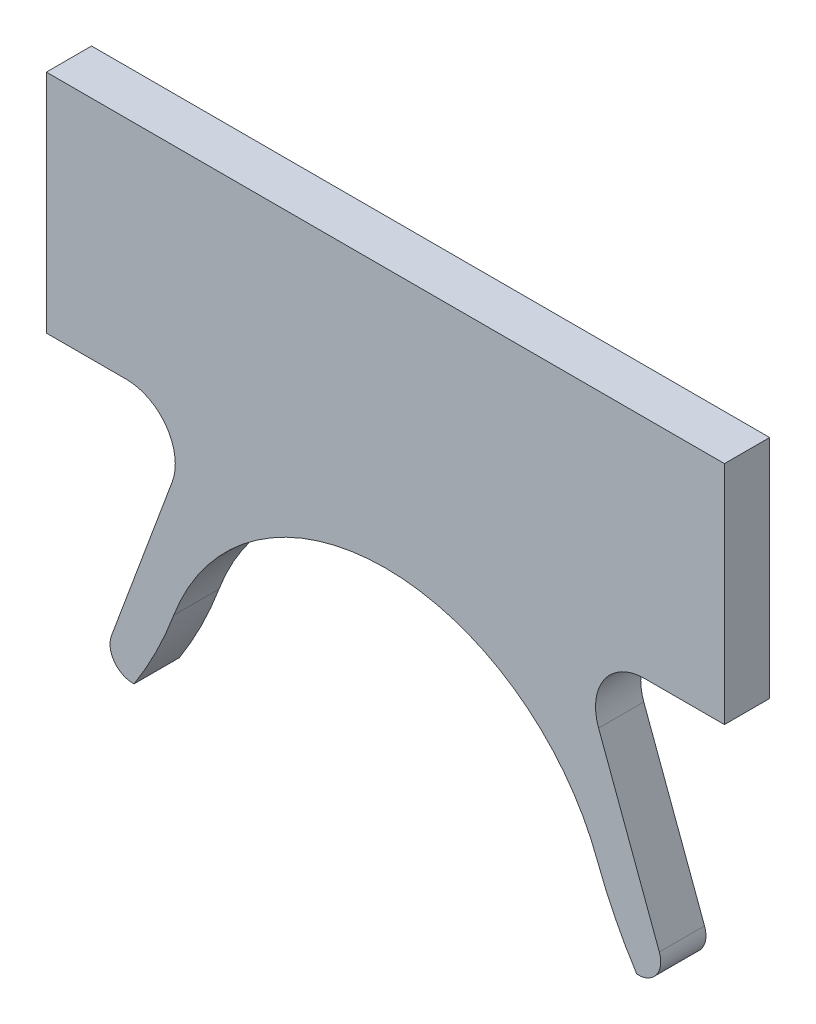
ISO-10303-21;
HEADER;
FILE_DESCRIPTION(('STEP AP214'),'2;1');
FILE_NAME('part.step','',(''),(''),'','','');
FILE_SCHEMA(('AUTOMOTIVE_DESIGN { 1 0 10303 214 1 1 1 1 }'));
ENDSEC;
DATA;
#1=APPLICATION_CONTEXT('core data for automotive mechanical design processes');
#2=APPLICATION_PROTOCOL_DEFINITION('international standard','automotive_design',2000,#1);
#3=PRODUCT_CONTEXT('',#1,'mechanical');
#4=PRODUCT('Part','Part','',(#3));
#5=PRODUCT_RELATED_PRODUCT_CATEGORY('part','',(#4));
#6=PRODUCT_DEFINITION_FORMATION('','',#4);
#7=PRODUCT_DEFINITION_CONTEXT('part definition',#1,'design');
#8=PRODUCT_DEFINITION('design','',#6,#7);
#9=PRODUCT_DEFINITION_SHAPE('','',#8);
#10=(LENGTH_UNIT() NAMED_UNIT(*) SI_UNIT(.MILLI.,.METRE.));
#11=(NAMED_UNIT(*) PLANE_ANGLE_UNIT() SI_UNIT($,.RADIAN.));
#12=(NAMED_UNIT(*) SI_UNIT($,.STERADIAN.) SOLID_ANGLE_UNIT());
#13=UNCERTAINTY_MEASURE_WITH_UNIT(LENGTH_MEASURE(1.E-05),#10,'distance_accuracy_value','');
#14=(GEOMETRIC_REPRESENTATION_CONTEXT(3) GLOBAL_UNCERTAINTY_ASSIGNED_CONTEXT((#13)) GLOBAL_UNIT_ASSIGNED_CONTEXT((#10,
#11,#12)) REPRESENTATION_CONTEXT('',''));
#15=CARTESIAN_POINT('',(0.,0.,0.));
#16=DIRECTION('',(0.,0.,1.));
#17=DIRECTION('',(1.,0.,0.));
#18=AXIS2_PLACEMENT_3D('',#15,#16,#17);
#19=CARTESIAN_POINT('',(-22.9188787127757,18.6730474571845,4.));
#20=DIRECTION('',(0.,0.,-1.));
#21=DIRECTION('',(-1.,0.,0.));
#22=AXIS2_PLACEMENT_3D('',#19,#20,#21);
#23=CYLINDRICAL_SURFACE('',#22,4.32695254281545);
#24=CARTESIAN_POINT('',(-22.9188787127757,18.6730474571845,0.));
#25=DIRECTION('',(0.,0.,-1.));
#26=DIRECTION('',(1.,0.,0.));
#27=AXIS2_PLACEMENT_3D('',#24,#25,#26);
#28=CIRCLE('',#27,4.32695254281545);
#29=CARTESIAN_POINT('',(-22.9188787127757,23.,0.));
#30=VERTEX_POINT('',#29);
#31=CARTESIAN_POINT('',(-18.8627272520322,17.1663445550549,0.));
#32=VERTEX_POINT('',#31);
#33=EDGE_CURVE('E179',#30,#32,#28,.T.);
#34=ORIENTED_EDGE('',*,*,#33,.T.);
#35=DIRECTION('',(0.,0.,-1.));
#36=VECTOR('',#35,1.);
#37=CARTESIAN_POINT('',(-18.8627272520322,17.1663445550549,4.));
#38=LINE('',#37,#36);
#39=CARTESIAN_POINT('',(-18.8627272520322,17.1663445550549,4.));
#40=VERTEX_POINT('',#39);
#41=EDGE_CURVE('E11',#40,#32,#38,.T.);
#42=ORIENTED_EDGE('',*,*,#41,.F.);
#43=CARTESIAN_POINT('',(-22.9188787127757,18.6730474571845,4.));
#44=DIRECTION('',(0.,0.,-1.));
#45=DIRECTION('',(1.,0.,0.));
#46=AXIS2_PLACEMENT_3D('',#43,#44,#45);
#47=CIRCLE('',#46,4.32695254281545);
#48=CARTESIAN_POINT('',(-22.9188787127757,23.,4.));
#49=VERTEX_POINT('',#48);
#50=EDGE_CURVE('E209',#49,#40,#47,.T.);
#51=ORIENTED_EDGE('',*,*,#50,.F.);
#52=DIRECTION('',(0.,0.,-1.));
#53=VECTOR('',#52,1.);
#54=CARTESIAN_POINT('',(-22.9188787127757,23.,4.));
#55=LINE('',#54,#53);
#56=EDGE_CURVE('E175',#49,#30,#55,.T.);
#57=ORIENTED_EDGE('',*,*,#56,.T.);
#58=EDGE_LOOP('',(#34,#42,#51,#57));
#59=FACE_BOUND('',#58,.T.);
#60=ADVANCED_FACE('F35',(#59),#23,.F.);
#61=CARTESIAN_POINT('',(-24.2377403042803,2.69642682105744,4.));
#62=DIRECTION('',(0.937415287227579,-0.348213410528709,0.));
#63=DIRECTION('',(0.348213410528709,0.937415287227579,0.));
#64=AXIS2_PLACEMENT_3D('',#61,#62,#63);
#65=PLANE('',#64);
#66=DIRECTION('',(-0.348213410528709,-0.937415287227579,0.));
#67=VECTOR('',#66,1.);
#68=CARTESIAN_POINT('',(-24.2377403042803,2.69642682105744,0.));
#69=LINE('',#68,#67);
#70=CARTESIAN_POINT('',(-24.2377403042803,2.69642682105744,0.));
#71=VERTEX_POINT('',#70);
#72=EDGE_CURVE('E182',#32,#71,#69,.T.);
#73=ORIENTED_EDGE('',*,*,#72,.T.);
#74=DIRECTION('',(0.,0.,-1.));
#75=VECTOR('',#74,1.);
#76=CARTESIAN_POINT('',(-24.2377403042803,2.69642682105744,4.));
#77=LINE('',#76,#75);
#78=CARTESIAN_POINT('',(-24.2377403042803,2.69642682105744,4.));
#79=VERTEX_POINT('',#78);
#80=EDGE_CURVE('E43',#79,#71,#77,.T.);
#81=ORIENTED_EDGE('',*,*,#80,.F.);
#82=DIRECTION('',(-0.348213410528709,-0.937415287227579,0.));
#83=VECTOR('',#82,1.);
#84=CARTESIAN_POINT('',(-24.2377403042803,2.69642682105744,4.));
#85=LINE('',#84,#83);
#86=EDGE_CURVE('E118',#40,#79,#85,.T.);
#87=ORIENTED_EDGE('',*,*,#86,.F.);
#88=ORIENTED_EDGE('',*,*,#41,.T.);
#89=EDGE_LOOP('',(#73,#81,#87,#88));
#90=FACE_BOUND('',#89,.T.);
#91=ADVANCED_FACE('F307',(#90),#65,.F.);
#92=CARTESIAN_POINT('',(-22.3629097298251,2.,4.));
#93=DIRECTION('',(0.,0.,-1.));
#94=DIRECTION('',(-1.,0.,0.));
#95=AXIS2_PLACEMENT_3D('',#92,#93,#94);
#96=CYLINDRICAL_SURFACE('',#95,2.);
#97=CARTESIAN_POINT('',(-22.3629097298251,2.,0.));
#98=DIRECTION('',(0.,0.,1.));
#99=DIRECTION('',(1.,0.,0.));
#100=AXIS2_PLACEMENT_3D('',#97,#98,#99);
#101=CIRCLE('',#100,2.);
#102=CARTESIAN_POINT('',(-22.3629097298251,0.,0.));
#103=VERTEX_POINT('',#102);
#104=EDGE_CURVE('E184',#71,#103,#101,.T.);
#105=ORIENTED_EDGE('',*,*,#104,.T.);
#106=DIRECTION('',(0.,0.,-1.));
#107=VECTOR('',#106,1.);
#108=CARTESIAN_POINT('',(-22.3629097298251,0.,4.));
#109=LINE('',#108,#107);
#110=CARTESIAN_POINT('',(-22.3629097298251,0.,4.));
#111=VERTEX_POINT('',#110);
#112=EDGE_CURVE('E240',#111,#103,#109,.T.);
#113=ORIENTED_EDGE('',*,*,#112,.F.);
#114=CARTESIAN_POINT('',(-22.3629097298251,2.,4.));
#115=DIRECTION('',(0.,0.,1.));
#116=DIRECTION('',(1.,0.,0.));
#117=AXIS2_PLACEMENT_3D('',#114,#115,#116);
#118=CIRCLE('',#117,2.);
#119=EDGE_CURVE('E248',#79,#111,#118,.T.);
#120=ORIENTED_EDGE('',*,*,#119,.F.);
#121=ORIENTED_EDGE('',*,*,#80,.T.);
#122=EDGE_LOOP('',(#105,#113,#120,#121));
#123=FACE_BOUND('',#122,.T.);
#124=ADVANCED_FACE('F246',(#123),#96,.T.);
#125=CARTESIAN_POINT('',(-22.2393582556777,0.,4.));
#126=DIRECTION('',(0.,1.,0.));
#127=DIRECTION('',(-1.,0.,0.));
#128=AXIS2_PLACEMENT_3D('',#125,#126,#127);
#129=PLANE('',#128);
#130=DIRECTION('',(1.,0.,0.));
#131=VECTOR('',#130,1.);
#132=CARTESIAN_POINT('',(-22.2393582556777,0.,0.));
#133=LINE('',#132,#131);
#134=CARTESIAN_POINT('',(-22.2393582556777,0.,0.));
#135=VERTEX_POINT('',#134);
#136=EDGE_CURVE('E186',#103,#135,#133,.T.);
#137=ORIENTED_EDGE('',*,*,#136,.T.);
#138=DIRECTION('',(0.,0.,-1.));
#139=VECTOR('',#138,1.);
#140=CARTESIAN_POINT('',(-22.2393582556777,0.,4.));
#141=LINE('',#140,#139);
#142=CARTESIAN_POINT('',(-22.2393582556777,0.,4.));
#143=VERTEX_POINT('',#142);
#144=EDGE_CURVE('E237',#143,#135,#141,.T.);
#145=ORIENTED_EDGE('',*,*,#144,.F.);
#146=DIRECTION('',(1.,0.,0.));
#147=VECTOR('',#146,1.);
#148=CARTESIAN_POINT('',(-22.2393582556777,0.,4.));
#149=LINE('',#148,#147);
#150=EDGE_CURVE('E266',#111,#143,#149,.T.);
#151=ORIENTED_EDGE('',*,*,#150,.F.);
#152=ORIENTED_EDGE('',*,*,#112,.T.);
#153=EDGE_LOOP('',(#137,#145,#151,#152));
#154=FACE_BOUND('',#153,.T.);
#155=ADVANCED_FACE('F257',(#154),#129,.F.);
#156=CARTESIAN_POINT('',(-53.4627327981077,20.0083136880861,4.));
#157=DIRECTION('',(0.,0.,-1.));
#158=DIRECTION('',(-1.,0.,0.));
#159=AXIS2_PLACEMENT_3D('',#156,#157,#158);
#160=CYLINDRICAL_SURFACE('',#159,37.0841170106249);
#161=CARTESIAN_POINT('',(-53.4627327981077,20.0083136880861,0.));
#162=DIRECTION('',(0.,0.,1.));
#163=DIRECTION('',(1.,0.,0.));
#164=AXIS2_PLACEMENT_3D('',#161,#162,#163);
#165=CIRCLE('',#164,37.0841170106249);
#166=CARTESIAN_POINT('',(-18.7312112713093,7.01011585564579,0.));
#167=VERTEX_POINT('',#166);
#168=EDGE_CURVE('E188',#135,#167,#165,.T.);
#169=ORIENTED_EDGE('',*,*,#168,.T.);
#170=DIRECTION('',(0.,0.,-1.));
#171=VECTOR('',#170,1.);
#172=CARTESIAN_POINT('',(-18.7312112713093,7.01011585564579,4.));
#173=LINE('',#172,#171);
#174=CARTESIAN_POINT('',(-18.7312112713093,7.01011585564579,4.));
#175=VERTEX_POINT('',#174);
#176=EDGE_CURVE('E234',#175,#167,#173,.T.);
#177=ORIENTED_EDGE('',*,*,#176,.F.);
#178=CARTESIAN_POINT('',(-53.4627327981077,20.0083136880861,4.));
#179=DIRECTION('',(0.,0.,1.));
#180=DIRECTION('',(1.,0.,0.));
#181=AXIS2_PLACEMENT_3D('',#178,#179,#180);
#182=CIRCLE('',#181,37.0841170106249);
#183=EDGE_CURVE('E263',#143,#175,#182,.T.);
#184=ORIENTED_EDGE('',*,*,#183,.F.);
#185=ORIENTED_EDGE('',*,*,#144,.T.);
#186=EDGE_LOOP('',(#169,#177,#184,#185));
#187=FACE_BOUND('',#186,.T.);
#188=ADVANCED_FACE('F261',(#187),#160,.T.);
#189=CARTESIAN_POINT('',(0.,0.,4.));
#190=DIRECTION('',(0.,0.,-1.));
#191=DIRECTION('',(-1.,0.,0.));
#192=AXIS2_PLACEMENT_3D('',#189,#190,#191);
#193=CYLINDRICAL_SURFACE('',#192,20.);
#194=CARTESIAN_POINT('',(0.,0.,0.));
#195=DIRECTION('',(0.,0.,-1.));
#196=DIRECTION('',(1.,0.,0.));
#197=AXIS2_PLACEMENT_3D('',#194,#195,#196);
#198=CIRCLE('',#197,20.);
#199=CARTESIAN_POINT('',(18.7312112713093,7.01011585564579,0.));
#200=VERTEX_POINT('',#199);
#201=EDGE_CURVE('E190',#167,#200,#198,.T.);
#202=ORIENTED_EDGE('',*,*,#201,.T.);
#203=DIRECTION('',(0.,0.,-1.));
#204=VECTOR('',#203,1.);
#205=CARTESIAN_POINT('',(18.7312112713093,7.01011585564579,4.));
#206=LINE('',#205,#204);
#207=CARTESIAN_POINT('',(18.7312112713093,7.01011585564579,4.));
#208=VERTEX_POINT('',#207);
#209=EDGE_CURVE('E231',#208,#200,#206,.T.);
#210=ORIENTED_EDGE('',*,*,#209,.F.);
#211=CARTESIAN_POINT('',(0.,0.,4.));
#212=DIRECTION('',(0.,0.,-1.));
#213=DIRECTION('',(1.,0.,0.));
#214=AXIS2_PLACEMENT_3D('',#211,#212,#213);
#215=CIRCLE('',#214,20.);
#216=EDGE_CURVE('E265',#175,#208,#215,.T.);
#217=ORIENTED_EDGE('',*,*,#216,.F.);
#218=ORIENTED_EDGE('',*,*,#176,.T.);
#219=EDGE_LOOP('',(#202,#210,#217,#218));
#220=FACE_BOUND('',#219,.T.);
#221=ADVANCED_FACE('F320',(#220),#193,.F.);
#222=CARTESIAN_POINT('',(53.4627327981077,20.0083136880861,4.));
#223=DIRECTION('',(0.,0.,-1.));
#224=DIRECTION('',(-1.,0.,0.));
#225=AXIS2_PLACEMENT_3D('',#222,#223,#224);
#226=CYLINDRICAL_SURFACE('',#225,37.0841170106249);
#227=CARTESIAN_POINT('',(53.4627327981077,20.0083136880861,0.));
#228=DIRECTION('',(0.,0.,1.));
#229=DIRECTION('',(-1.,0.,0.));
#230=AXIS2_PLACEMENT_3D('',#227,#228,#229);
#231=CIRCLE('',#230,37.0841170106249);
#232=CARTESIAN_POINT('',(22.2393582556777,0.,0.));
#233=VERTEX_POINT('',#232);
#234=EDGE_CURVE('E192',#200,#233,#231,.T.);
#235=ORIENTED_EDGE('',*,*,#234,.T.);
#236=DIRECTION('',(0.,0.,-1.));
#237=VECTOR('',#236,1.);
#238=CARTESIAN_POINT('',(22.2393582556777,0.,4.));
#239=LINE('',#238,#237);
#240=CARTESIAN_POINT('',(22.2393582556777,0.,4.));
#241=VERTEX_POINT('',#240);
#242=EDGE_CURVE('E228',#241,#233,#239,.T.);
#243=ORIENTED_EDGE('',*,*,#242,.F.);
#244=CARTESIAN_POINT('',(53.4627327981077,20.0083136880861,4.));
#245=DIRECTION('',(0.,0.,1.));
#246=DIRECTION('',(-1.,0.,0.));
#247=AXIS2_PLACEMENT_3D('',#244,#245,#246);
#248=CIRCLE('',#247,37.0841170106249);
#249=EDGE_CURVE('E268',#208,#241,#248,.T.);
#250=ORIENTED_EDGE('',*,*,#249,.F.);
#251=ORIENTED_EDGE('',*,*,#209,.T.);
#252=EDGE_LOOP('',(#235,#243,#250,#251));
#253=FACE_BOUND('',#252,.T.);
#254=ADVANCED_FACE('F323',(#253),#226,.T.);
#255=CARTESIAN_POINT('',(22.2393582556777,0.,4.));
#256=DIRECTION('',(0.,1.,0.));
#257=DIRECTION('',(-1.,0.,0.));
#258=AXIS2_PLACEMENT_3D('',#255,#256,#257);
#259=PLANE('',#258);
#260=DIRECTION('',(1.,0.,0.));
#261=VECTOR('',#260,1.);
#262=CARTESIAN_POINT('',(22.2393582556777,0.,0.));
#263=LINE('',#262,#261);
#264=CARTESIAN_POINT('',(22.3629097298251,0.,0.));
#265=VERTEX_POINT('',#264);
#266=EDGE_CURVE('E194',#233,#265,#263,.T.);
#267=ORIENTED_EDGE('',*,*,#266,.T.);
#268=DIRECTION('',(0.,0.,-1.));
#269=VECTOR('',#268,1.);
#270=CARTESIAN_POINT('',(22.3629097298251,0.,4.));
#271=LINE('',#270,#269);
#272=CARTESIAN_POINT('',(22.3629097298251,0.,4.));
#273=VERTEX_POINT('',#272);
#274=EDGE_CURVE('E225',#273,#265,#271,.T.);
#275=ORIENTED_EDGE('',*,*,#274,.F.);
#276=DIRECTION('',(1.,0.,0.));
#277=VECTOR('',#276,1.);
#278=CARTESIAN_POINT('',(22.2393582556777,0.,4.));
#279=LINE('',#278,#277);
#280=EDGE_CURVE('E274',#241,#273,#279,.T.);
#281=ORIENTED_EDGE('',*,*,#280,.F.);
#282=ORIENTED_EDGE('',*,*,#242,.T.);
#283=EDGE_LOOP('',(#267,#275,#281,#282));
#284=FACE_BOUND('',#283,.T.);
#285=ADVANCED_FACE('F327',(#284),#259,.F.);
#286=CARTESIAN_POINT('',(22.3629097298251,2.,4.));
#287=DIRECTION('',(0.,0.,-1.));
#288=DIRECTION('',(-1.,0.,0.));
#289=AXIS2_PLACEMENT_3D('',#286,#287,#288);
#290=CYLINDRICAL_SURFACE('',#289,2.);
#291=CARTESIAN_POINT('',(22.3629097298251,2.,0.));
#292=DIRECTION('',(0.,0.,1.));
#293=DIRECTION('',(-1.,0.,0.));
#294=AXIS2_PLACEMENT_3D('',#291,#292,#293);
#295=CIRCLE('',#294,2.);
#296=CARTESIAN_POINT('',(24.2377403042803,2.69642682105744,0.));
#297=VERTEX_POINT('',#296);
#298=EDGE_CURVE('E196',#265,#297,#295,.T.);
#299=ORIENTED_EDGE('',*,*,#298,.T.);
#300=DIRECTION('',(0.,0.,-1.));
#301=VECTOR('',#300,1.);
#302=CARTESIAN_POINT('',(24.2377403042803,2.69642682105744,4.));
#303=LINE('',#302,#301);
#304=CARTESIAN_POINT('',(24.2377403042803,2.69642682105744,4.));
#305=VERTEX_POINT('',#304);
#306=EDGE_CURVE('E222',#305,#297,#303,.T.);
#307=ORIENTED_EDGE('',*,*,#306,.F.);
#308=CARTESIAN_POINT('',(22.3629097298251,2.,4.));
#309=DIRECTION('',(0.,0.,1.));
#310=DIRECTION('',(-1.,0.,0.));
#311=AXIS2_PLACEMENT_3D('',#308,#309,#310);
#312=CIRCLE('',#311,2.);
#313=EDGE_CURVE('E276',#273,#305,#312,.T.);
#314=ORIENTED_EDGE('',*,*,#313,.F.);
#315=ORIENTED_EDGE('',*,*,#274,.T.);
#316=EDGE_LOOP('',(#299,#307,#314,#315));
#317=FACE_BOUND('',#316,.T.);
#318=ADVANCED_FACE('F331',(#317),#290,.T.);
#319=CARTESIAN_POINT('',(24.2377403042803,2.69642682105744,4.));
#320=DIRECTION('',(-0.937415287227579,-0.348213410528709,0.));
#321=DIRECTION('',(0.348213410528709,-0.937415287227579,0.));
#322=AXIS2_PLACEMENT_3D('',#319,#320,#321);
#323=PLANE('',#322);
#324=DIRECTION('',(-0.348213410528709,0.937415287227579,0.));
#325=VECTOR('',#324,1.);
#326=CARTESIAN_POINT('',(24.2377403042803,2.69642682105744,0.));
#327=LINE('',#326,#325);
#328=CARTESIAN_POINT('',(18.8627272520322,17.1663445550549,0.));
#329=VERTEX_POINT('',#328);
#330=EDGE_CURVE('E198',#297,#329,#327,.T.);
#331=ORIENTED_EDGE('',*,*,#330,.T.);
#332=DIRECTION('',(0.,0.,-1.));
#333=VECTOR('',#332,1.);
#334=CARTESIAN_POINT('',(18.8627272520322,17.1663445550549,4.));
#335=LINE('',#334,#333);
#336=CARTESIAN_POINT('',(18.8627272520322,17.1663445550549,4.));
#337=VERTEX_POINT('',#336);
#338=EDGE_CURVE('E219',#337,#329,#335,.T.);
#339=ORIENTED_EDGE('',*,*,#338,.F.);
#340=DIRECTION('',(-0.348213410528709,0.937415287227579,0.));
#341=VECTOR('',#340,1.);
#342=CARTESIAN_POINT('',(24.2377403042803,2.69642682105744,4.));
#343=LINE('',#342,#341);
#344=EDGE_CURVE('E278',#305,#337,#343,.T.);
#345=ORIENTED_EDGE('',*,*,#344,.F.);
#346=ORIENTED_EDGE('',*,*,#306,.T.);
#347=EDGE_LOOP('',(#331,#339,#345,#346));
#348=FACE_BOUND('',#347,.T.);
#349=ADVANCED_FACE('F335',(#348),#323,.F.);
#350=CARTESIAN_POINT('',(22.9188787127757,18.6730474571845,4.));
#351=DIRECTION('',(0.,0.,-1.));
#352=DIRECTION('',(-1.,0.,0.));
#353=AXIS2_PLACEMENT_3D('',#350,#351,#352);
#354=CYLINDRICAL_SURFACE('',#353,4.32695254281545);
#355=CARTESIAN_POINT('',(22.9188787127757,18.6730474571845,0.));
#356=DIRECTION('',(0.,0.,-1.));
#357=DIRECTION('',(-1.,0.,0.));
#358=AXIS2_PLACEMENT_3D('',#355,#356,#357);
#359=CIRCLE('',#358,4.32695254281545);
#360=CARTESIAN_POINT('',(22.9188787127757,23.,0.));
#361=VERTEX_POINT('',#360);
#362=EDGE_CURVE('E200',#329,#361,#359,.T.);
#363=ORIENTED_EDGE('',*,*,#362,.T.);
#364=DIRECTION('',(0.,0.,-1.));
#365=VECTOR('',#364,1.);
#366=CARTESIAN_POINT('',(22.9188787127757,23.,4.));
#367=LINE('',#366,#365);
#368=CARTESIAN_POINT('',(22.9188787127757,23.,4.));
#369=VERTEX_POINT('',#368);
#370=EDGE_CURVE('E216',#369,#361,#367,.T.);
#371=ORIENTED_EDGE('',*,*,#370,.F.);
#372=CARTESIAN_POINT('',(22.9188787127757,18.6730474571845,4.));
#373=DIRECTION('',(0.,0.,-1.));
#374=DIRECTION('',(-1.,0.,0.));
#375=AXIS2_PLACEMENT_3D('',#372,#373,#374);
#376=CIRCLE('',#375,4.32695254281545);
#377=EDGE_CURVE('E280',#337,#369,#376,.T.);
#378=ORIENTED_EDGE('',*,*,#377,.F.);
#379=ORIENTED_EDGE('',*,*,#338,.T.);
#380=EDGE_LOOP('',(#363,#371,#378,#379));
#381=FACE_BOUND('',#380,.T.);
#382=ADVANCED_FACE('F339',(#381),#354,.F.);
#383=CARTESIAN_POINT('',(22.9188787127757,23.,4.));
#384=DIRECTION('',(0.,1.,0.));
#385=DIRECTION('',(0.,0.,1.));
#386=AXIS2_PLACEMENT_3D('',#383,#384,#385);
#387=PLANE('',#386);
#388=DIRECTION('',(1.,0.,0.));
#389=VECTOR('',#388,1.);
#390=CARTESIAN_POINT('',(22.9188787127757,23.,0.));
#391=LINE('',#390,#389);
#392=CARTESIAN_POINT('',(30.,23.,0.));
#393=VERTEX_POINT('',#392);
#394=EDGE_CURVE('E202',#361,#393,#391,.T.);
#395=ORIENTED_EDGE('',*,*,#394,.T.);
#396=DIRECTION('',(0.,0.,-1.));
#397=VECTOR('',#396,1.);
#398=CARTESIAN_POINT('',(30.,23.,4.));
#399=LINE('',#398,#397);
#400=CARTESIAN_POINT('',(30.,23.,4.));
#401=VERTEX_POINT('',#400);
#402=EDGE_CURVE('E213',#401,#393,#399,.T.);
#403=ORIENTED_EDGE('',*,*,#402,.F.);
#404=DIRECTION('',(1.,0.,0.));
#405=VECTOR('',#404,1.);
#406=CARTESIAN_POINT('',(22.9188787127757,23.,4.));
#407=LINE('',#406,#405);
#408=EDGE_CURVE('E282',#369,#401,#407,.T.);
#409=ORIENTED_EDGE('',*,*,#408,.F.);
#410=ORIENTED_EDGE('',*,*,#370,.T.);
#411=EDGE_LOOP('',(#395,#403,#409,#410));
#412=FACE_BOUND('',#411,.T.);
#413=ADVANCED_FACE('F288',(#412),#387,.F.);
#414=CARTESIAN_POINT('',(30.,43.,4.));
#415=DIRECTION('',(-1.,0.,0.));
#416=DIRECTION('',(0.,0.,1.));
#417=AXIS2_PLACEMENT_3D('',#414,#415,#416);
#418=PLANE('',#417);
#419=DIRECTION('',(0.,1.,0.));
#420=VECTOR('',#419,1.);
#421=CARTESIAN_POINT('',(30.,43.,0.));
#422=LINE('',#421,#420);
#423=CARTESIAN_POINT('',(30.,43.,0.));
#424=VERTEX_POINT('',#423);
#425=EDGE_CURVE('E204',#393,#424,#422,.T.);
#426=ORIENTED_EDGE('',*,*,#425,.T.);
#427=DIRECTION('',(0.,0.,-1.));
#428=VECTOR('',#427,1.);
#429=CARTESIAN_POINT('',(30.,43.,4.));
#430=LINE('',#429,#428);
#431=CARTESIAN_POINT('',(30.,43.,4.));
#432=VERTEX_POINT('',#431);
#433=EDGE_CURVE('E170',#432,#424,#430,.T.);
#434=ORIENTED_EDGE('',*,*,#433,.F.);
#435=DIRECTION('',(0.,1.,0.));
#436=VECTOR('',#435,1.);
#437=CARTESIAN_POINT('',(30.,43.,4.));
#438=LINE('',#437,#436);
#439=EDGE_CURVE('E161',#401,#432,#438,.T.);
#440=ORIENTED_EDGE('',*,*,#439,.F.);
#441=ORIENTED_EDGE('',*,*,#402,.T.);
#442=EDGE_LOOP('',(#426,#434,#440,#441));
#443=FACE_BOUND('',#442,.T.);
#444=ADVANCED_FACE('F292',(#443),#418,.F.);
#445=CARTESIAN_POINT('',(-30.,43.,4.));
#446=DIRECTION('',(0.,-1.,0.));
#447=DIRECTION('',(0.,0.,-1.));
#448=AXIS2_PLACEMENT_3D('',#445,#446,#447);
#449=PLANE('',#448);
#450=DIRECTION('',(-1.,0.,0.));
#451=VECTOR('',#450,1.);
#452=CARTESIAN_POINT('',(-30.,43.,0.));
#453=LINE('',#452,#451);
#454=CARTESIAN_POINT('',(-30.,43.,0.));
#455=VERTEX_POINT('',#454);
#456=EDGE_CURVE('E169',#424,#455,#453,.T.);
#457=ORIENTED_EDGE('',*,*,#456,.T.);
#458=DIRECTION('',(0.,0.,-1.));
#459=VECTOR('',#458,1.);
#460=CARTESIAN_POINT('',(-30.,43.,4.));
#461=LINE('',#460,#459);
#462=CARTESIAN_POINT('',(-30.,43.,4.));
#463=VERTEX_POINT('',#462);
#464=EDGE_CURVE('E166',#463,#455,#461,.T.);
#465=ORIENTED_EDGE('',*,*,#464,.F.);
#466=DIRECTION('',(-1.,0.,0.));
#467=VECTOR('',#466,1.);
#468=CARTESIAN_POINT('',(-30.,43.,4.));
#469=LINE('',#468,#467);
#470=EDGE_CURVE('E155',#432,#463,#469,.T.);
#471=ORIENTED_EDGE('',*,*,#470,.F.);
#472=ORIENTED_EDGE('',*,*,#433,.T.);
#473=EDGE_LOOP('',(#457,#465,#471,#472));
#474=FACE_BOUND('',#473,.T.);
#475=ADVANCED_FACE('F167',(#474),#449,.F.);
#476=CARTESIAN_POINT('',(-30.,23.,4.));
#477=DIRECTION('',(1.,0.,0.));
#478=DIRECTION('',(0.,0.,-1.));
#479=AXIS2_PLACEMENT_3D('',#476,#477,#478);
#480=PLANE('',#479);
#481=DIRECTION('',(0.,-1.,0.));
#482=VECTOR('',#481,1.);
#483=CARTESIAN_POINT('',(-30.,23.,0.));
#484=LINE('',#483,#482);
#485=CARTESIAN_POINT('',(-30.,23.,0.));
#486=VERTEX_POINT('',#485);
#487=EDGE_CURVE('E104',#455,#486,#484,.T.);
#488=ORIENTED_EDGE('',*,*,#487,.T.);
#489=DIRECTION('',(0.,0.,-1.));
#490=VECTOR('',#489,1.);
#491=CARTESIAN_POINT('',(-30.,23.,4.));
#492=LINE('',#491,#490);
#493=CARTESIAN_POINT('',(-30.,23.,4.));
#494=VERTEX_POINT('',#493);
#495=EDGE_CURVE('E171',#494,#486,#492,.T.);
#496=ORIENTED_EDGE('',*,*,#495,.F.);
#497=DIRECTION('',(0.,-1.,0.));
#498=VECTOR('',#497,1.);
#499=CARTESIAN_POINT('',(-30.,23.,4.));
#500=LINE('',#499,#498);
#501=EDGE_CURVE('E159',#463,#494,#500,.T.);
#502=ORIENTED_EDGE('',*,*,#501,.F.);
#503=ORIENTED_EDGE('',*,*,#464,.T.);
#504=EDGE_LOOP('',(#488,#496,#502,#503));
#505=FACE_BOUND('',#504,.T.);
#506=ADVANCED_FACE('F173',(#505),#480,.F.);
#507=CARTESIAN_POINT('',(-30.,23.,4.));
#508=DIRECTION('',(0.,1.,0.));
#509=DIRECTION('',(0.,0.,1.));
#510=AXIS2_PLACEMENT_3D('',#507,#508,#509);
#511=PLANE('',#510);
#512=DIRECTION('',(1.,0.,0.));
#513=VECTOR('',#512,1.);
#514=CARTESIAN_POINT('',(-30.,23.,0.));
#515=LINE('',#514,#513);
#516=EDGE_CURVE('E110',#486,#30,#515,.T.);
#517=ORIENTED_EDGE('',*,*,#516,.T.);
#518=ORIENTED_EDGE('',*,*,#56,.F.);
#519=DIRECTION('',(1.,0.,0.));
#520=VECTOR('',#519,1.);
#521=CARTESIAN_POINT('',(-30.,23.,4.));
#522=LINE('',#521,#520);
#523=EDGE_CURVE('E51',#494,#49,#522,.T.);
#524=ORIENTED_EDGE('',*,*,#523,.F.);
#525=ORIENTED_EDGE('',*,*,#495,.T.);
#526=EDGE_LOOP('',(#517,#518,#524,#525));
#527=FACE_BOUND('',#526,.T.);
#528=ADVANCED_FACE('F296',(#527),#511,.F.);
#529=CARTESIAN_POINT('',(-22.9188787127757,18.6730474571845,4.));
#530=DIRECTION('',(0.,0.,1.));
#531=DIRECTION('',(1.,0.,0.));
#532=AXIS2_PLACEMENT_3D('',#529,#530,#531);
#533=PLANE('',#532);
#534=ORIENTED_EDGE('',*,*,#50,.T.);
#535=ORIENTED_EDGE('',*,*,#86,.T.);
#536=ORIENTED_EDGE('',*,*,#119,.T.);
#537=ORIENTED_EDGE('',*,*,#150,.T.);
#538=ORIENTED_EDGE('',*,*,#183,.T.);
#539=ORIENTED_EDGE('',*,*,#216,.T.);
#540=ORIENTED_EDGE('',*,*,#249,.T.);
#541=ORIENTED_EDGE('',*,*,#280,.T.);
#542=ORIENTED_EDGE('',*,*,#313,.T.);
#543=ORIENTED_EDGE('',*,*,#344,.T.);
#544=ORIENTED_EDGE('',*,*,#377,.T.);
#545=ORIENTED_EDGE('',*,*,#408,.T.);
#546=ORIENTED_EDGE('',*,*,#439,.T.);
#547=ORIENTED_EDGE('',*,*,#470,.T.);
#548=ORIENTED_EDGE('',*,*,#501,.T.);
#549=ORIENTED_EDGE('',*,*,#523,.T.);
#550=EDGE_LOOP('',(#534,#535,#536,#537,#538,#539,#540,#541,#542,#543,#544,#545,#546,#547,#548,#549));
#551=FACE_BOUND('',#550,.T.);
#552=ADVANCED_FACE('F157',(#551),#533,.T.);
#553=CARTESIAN_POINT('',(-22.9188787127757,18.6730474571845,0.));
#554=DIRECTION('',(0.,0.,1.));
#555=DIRECTION('',(1.,0.,0.));
#556=AXIS2_PLACEMENT_3D('',#553,#554,#555);
#557=PLANE('',#556);
#558=ORIENTED_EDGE('',*,*,#33,.F.);
#559=ORIENTED_EDGE('',*,*,#516,.F.);
#560=ORIENTED_EDGE('',*,*,#487,.F.);
#561=ORIENTED_EDGE('',*,*,#456,.F.);
#562=ORIENTED_EDGE('',*,*,#425,.F.);
#563=ORIENTED_EDGE('',*,*,#394,.F.);
#564=ORIENTED_EDGE('',*,*,#362,.F.);
#565=ORIENTED_EDGE('',*,*,#330,.F.);
#566=ORIENTED_EDGE('',*,*,#298,.F.);
#567=ORIENTED_EDGE('',*,*,#266,.F.);
#568=ORIENTED_EDGE('',*,*,#234,.F.);
#569=ORIENTED_EDGE('',*,*,#201,.F.);
#570=ORIENTED_EDGE('',*,*,#168,.F.);
#571=ORIENTED_EDGE('',*,*,#136,.F.);
#572=ORIENTED_EDGE('',*,*,#104,.F.);
#573=ORIENTED_EDGE('',*,*,#72,.F.);
#574=EDGE_LOOP('',(#558,#559,#560,#561,#562,#563,#564,#565,#566,#567,#568,#569,#570,#571,#572,#573));
#575=FACE_BOUND('',#574,.T.);
#576=ADVANCED_FACE('F252',(#575),#557,.F.);
#577=CLOSED_SHELL('',(#60,#91,#124,#155,#188,#221,#254,#285,#318,#349,#382,#413,#444,#475,#506,
#528,#552,#576));
#578=MANIFOLD_SOLID_BREP('B2',#577);
#579=ADVANCED_BREP_SHAPE_REPRESENTATION('',(#18,#578),#14);
#580=SHAPE_DEFINITION_REPRESENTATION(#9,#579);
ENDSEC;
END-ISO-10303-21;
